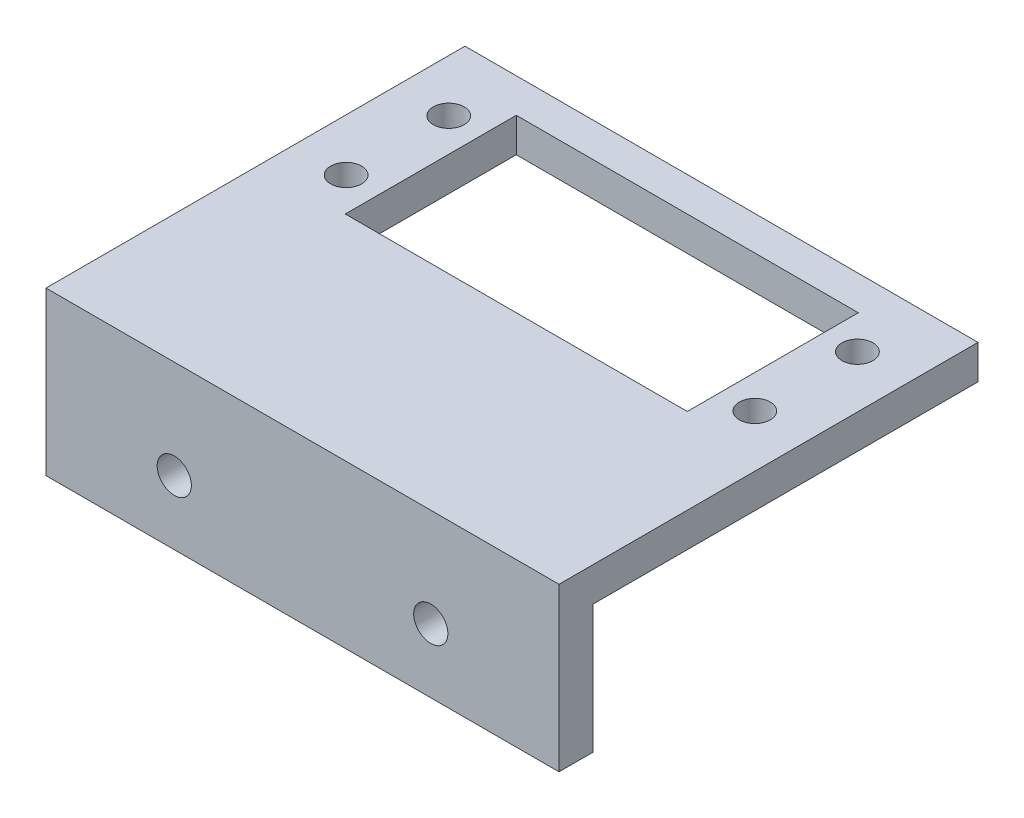
ISO-10303-21;
HEADER;
FILE_DESCRIPTION(('STEP AP214'),'2;1');
FILE_NAME('part.step','',(''),(''),'','','');
FILE_SCHEMA(('AUTOMOTIVE_DESIGN { 1 0 10303 214 1 1 1 1 }'));
ENDSEC;
DATA;
#1=APPLICATION_CONTEXT('core data for automotive mechanical design processes');
#2=APPLICATION_PROTOCOL_DEFINITION('international standard','automotive_design',2000,#1);
#3=PRODUCT_CONTEXT('',#1,'mechanical');
#4=PRODUCT('Part','Part','',(#3));
#5=PRODUCT_RELATED_PRODUCT_CATEGORY('part','',(#4));
#6=PRODUCT_DEFINITION_FORMATION('','',#4);
#7=PRODUCT_DEFINITION_CONTEXT('part definition',#1,'design');
#8=PRODUCT_DEFINITION('design','',#6,#7);
#9=PRODUCT_DEFINITION_SHAPE('','',#8);
#10=(LENGTH_UNIT() NAMED_UNIT(*) SI_UNIT(.MILLI.,.METRE.));
#11=(NAMED_UNIT(*) PLANE_ANGLE_UNIT() SI_UNIT($,.RADIAN.));
#12=(NAMED_UNIT(*) SI_UNIT($,.STERADIAN.) SOLID_ANGLE_UNIT());
#13=UNCERTAINTY_MEASURE_WITH_UNIT(LENGTH_MEASURE(1.E-05),#10,'distance_accuracy_value','');
#14=(GEOMETRIC_REPRESENTATION_CONTEXT(3) GLOBAL_UNCERTAINTY_ASSIGNED_CONTEXT((#13)) GLOBAL_UNIT_ASSIGNED_CONTEXT((#10,
#11,#12)) REPRESENTATION_CONTEXT('',''));
#15=CARTESIAN_POINT('',(0.,0.,0.));
#16=DIRECTION('',(0.,0.,1.));
#17=DIRECTION('',(1.,0.,0.));
#18=AXIS2_PLACEMENT_3D('',#15,#16,#17);
#19=CARTESIAN_POINT('',(30.,-25.,4.));
#20=DIRECTION('',(-1.,0.,0.));
#21=DIRECTION('',(0.,0.,1.));
#22=AXIS2_PLACEMENT_3D('',#19,#20,#21);
#23=PLANE('',#22);
#24=DIRECTION('',(0.,1.,0.));
#25=VECTOR('',#24,1.);
#26=CARTESIAN_POINT('',(30.,-25.,4.));
#27=LINE('',#26,#25);
#28=CARTESIAN_POINT('',(30.,6.,4.));
#29=VERTEX_POINT('',#28);
#30=CARTESIAN_POINT('',(30.,25.,4.));
#31=VERTEX_POINT('',#30);
#32=EDGE_CURVE('E137',#29,#31,#27,.T.);
#33=ORIENTED_EDGE('',*,*,#32,.F.);
#34=DIRECTION('',(0.,0.,-1.));
#35=VECTOR('',#34,1.);
#36=CARTESIAN_POINT('',(30.,6.,10.));
#37=LINE('',#36,#35);
#38=CARTESIAN_POINT('',(30.,6.,0.));
#39=VERTEX_POINT('',#38);
#40=EDGE_CURVE('E123',#29,#39,#37,.T.);
#41=ORIENTED_EDGE('',*,*,#40,.T.);
#42=DIRECTION('',(0.,1.,0.));
#43=VECTOR('',#42,1.);
#44=CARTESIAN_POINT('',(30.,-25.,0.));
#45=LINE('',#44,#43);
#46=CARTESIAN_POINT('',(30.,21.,0.));
#47=VERTEX_POINT('',#46);
#48=EDGE_CURVE('E134',#39,#47,#45,.T.);
#49=ORIENTED_EDGE('',*,*,#48,.T.);
#50=DIRECTION('',(0.,0.,1.));
#51=VECTOR('',#50,1.);
#52=CARTESIAN_POINT('',(30.,21.,-45.));
#53=LINE('',#52,#51);
#54=CARTESIAN_POINT('',(30.,21.,-45.));
#55=VERTEX_POINT('',#54);
#56=EDGE_CURVE('E147',#55,#47,#53,.T.);
#57=ORIENTED_EDGE('',*,*,#56,.F.);
#58=DIRECTION('',(0.,-1.,0.));
#59=VECTOR('',#58,1.);
#60=CARTESIAN_POINT('',(30.,25.,-45.));
#61=LINE('',#60,#59);
#62=CARTESIAN_POINT('',(30.,25.,-45.));
#63=VERTEX_POINT('',#62);
#64=EDGE_CURVE('E253',#63,#55,#61,.T.);
#65=ORIENTED_EDGE('',*,*,#64,.F.);
#66=DIRECTION('',(0.,0.,-1.));
#67=VECTOR('',#66,1.);
#68=CARTESIAN_POINT('',(30.,25.,4.));
#69=LINE('',#68,#67);
#70=EDGE_CURVE('E161',#31,#63,#69,.T.);
#71=ORIENTED_EDGE('',*,*,#70,.F.);
#72=EDGE_LOOP('',(#33,#41,#49,#57,#65,#71));
#73=FACE_BOUND('',#72,.T.);
#74=ADVANCED_FACE('F43',(#73),#23,.F.);
#75=CARTESIAN_POINT('',(-30.,25.,4.));
#76=DIRECTION('',(0.,-1.,0.));
#77=DIRECTION('',(0.,0.,-1.));
#78=AXIS2_PLACEMENT_3D('',#75,#76,#77);
#79=PLANE('',#78);
#80=CARTESIAN_POINT('',(-23.9,25.,-37.));
#81=DIRECTION('',(0.,1.,0.));
#82=DIRECTION('',(0.,0.,1.));
#83=AXIS2_PLACEMENT_3D('',#80,#81,#82);
#84=CIRCLE('',#83,1.81);
#85=CARTESIAN_POINT('',(-23.9,25.,-35.19));
#86=VERTEX_POINT('',#85);
#87=EDGE_CURVE('E187',#86,#86,#84,.T.);
#88=ORIENTED_EDGE('',*,*,#87,.F.);
#89=EDGE_LOOP('',(#88));
#90=FACE_BOUND('',#89,.T.);
#91=CARTESIAN_POINT('',(-23.9,25.,-25.));
#92=DIRECTION('',(0.,1.,0.));
#93=DIRECTION('',(0.,0.,1.));
#94=AXIS2_PLACEMENT_3D('',#91,#92,#93);
#95=CIRCLE('',#94,1.81);
#96=CARTESIAN_POINT('',(-23.9,25.,-23.19));
#97=VERTEX_POINT('',#96);
#98=EDGE_CURVE('E195',#97,#97,#95,.T.);
#99=ORIENTED_EDGE('',*,*,#98,.F.);
#100=EDGE_LOOP('',(#99));
#101=FACE_BOUND('',#100,.T.);
#102=CARTESIAN_POINT('',(23.9,25.,-25.));
#103=DIRECTION('',(0.,1.,0.));
#104=DIRECTION('',(0.,0.,1.));
#105=AXIS2_PLACEMENT_3D('',#102,#103,#104);
#106=CIRCLE('',#105,1.81);
#107=CARTESIAN_POINT('',(23.9,25.,-23.19));
#108=VERTEX_POINT('',#107);
#109=EDGE_CURVE('E180',#108,#108,#106,.T.);
#110=ORIENTED_EDGE('',*,*,#109,.F.);
#111=EDGE_LOOP('',(#110));
#112=FACE_BOUND('',#111,.T.);
#113=CARTESIAN_POINT('',(23.9,25.,-37.));
#114=DIRECTION('',(0.,1.,0.));
#115=DIRECTION('',(0.,0.,1.));
#116=AXIS2_PLACEMENT_3D('',#113,#114,#115);
#117=CIRCLE('',#116,1.81);
#118=CARTESIAN_POINT('',(23.9,25.,-35.19));
#119=VERTEX_POINT('',#118);
#120=EDGE_CURVE('E193',#119,#119,#117,.T.);
#121=ORIENTED_EDGE('',*,*,#120,.F.);
#122=EDGE_LOOP('',(#121));
#123=FACE_BOUND('',#122,.T.);
#124=DIRECTION('',(-1.,0.,0.));
#125=VECTOR('',#124,1.);
#126=CARTESIAN_POINT('',(-20.,25.,-41.));
#127=LINE('',#126,#125);
#128=CARTESIAN_POINT('',(20.,25.,-41.));
#129=VERTEX_POINT('',#128);
#130=CARTESIAN_POINT('',(-20.,25.,-41.));
#131=VERTEX_POINT('',#130);
#132=EDGE_CURVE('E229',#129,#131,#127,.T.);
#133=ORIENTED_EDGE('',*,*,#132,.F.);
#134=DIRECTION('',(0.,0.,-1.));
#135=VECTOR('',#134,1.);
#136=CARTESIAN_POINT('',(20.,25.,-21.));
#137=LINE('',#136,#135);
#138=CARTESIAN_POINT('',(20.,25.,-21.));
#139=VERTEX_POINT('',#138);
#140=EDGE_CURVE('E68',#139,#129,#137,.T.);
#141=ORIENTED_EDGE('',*,*,#140,.F.);
#142=DIRECTION('',(1.,0.,0.));
#143=VECTOR('',#142,1.);
#144=CARTESIAN_POINT('',(-20.,25.,-21.));
#145=LINE('',#144,#143);
#146=CARTESIAN_POINT('',(-20.,25.,-21.));
#147=VERTEX_POINT('',#146);
#148=EDGE_CURVE('E237',#147,#139,#145,.T.);
#149=ORIENTED_EDGE('',*,*,#148,.F.);
#150=DIRECTION('',(0.,0.,1.));
#151=VECTOR('',#150,1.);
#152=CARTESIAN_POINT('',(-20.,25.,-21.));
#153=LINE('',#152,#151);
#154=EDGE_CURVE('E233',#131,#147,#153,.T.);
#155=ORIENTED_EDGE('',*,*,#154,.F.);
#156=EDGE_LOOP('',(#133,#141,#149,#155));
#157=FACE_BOUND('',#156,.T.);
#158=ORIENTED_EDGE('',*,*,#70,.T.);
#159=DIRECTION('',(1.,0.,0.));
#160=VECTOR('',#159,1.);
#161=CARTESIAN_POINT('',(30.,25.,-45.));
#162=LINE('',#161,#160);
#163=CARTESIAN_POINT('',(-30.,25.,-45.));
#164=VERTEX_POINT('',#163);
#165=EDGE_CURVE('E264',#164,#63,#162,.T.);
#166=ORIENTED_EDGE('',*,*,#165,.F.);
#167=DIRECTION('',(0.,0.,-1.));
#168=VECTOR('',#167,1.);
#169=CARTESIAN_POINT('',(-30.,25.,4.));
#170=LINE('',#169,#168);
#171=CARTESIAN_POINT('',(-30.,25.,4.));
#172=VERTEX_POINT('',#171);
#173=EDGE_CURVE('E158',#172,#164,#170,.T.);
#174=ORIENTED_EDGE('',*,*,#173,.F.);
#175=DIRECTION('',(-1.,0.,0.));
#176=VECTOR('',#175,1.);
#177=CARTESIAN_POINT('',(-30.,25.,4.));
#178=LINE('',#177,#176);
#179=EDGE_CURVE('E274',#31,#172,#178,.T.);
#180=ORIENTED_EDGE('',*,*,#179,.F.);
#181=EDGE_LOOP('',(#158,#166,#174,#180));
#182=FACE_BOUND('',#181,.T.);
#183=ADVANCED_FACE('F294',(#90,#101,#112,#123,#157,#182),#79,.F.);
#184=CARTESIAN_POINT('',(-30.,-25.,4.));
#185=DIRECTION('',(1.,0.,0.));
#186=DIRECTION('',(0.,0.,-1.));
#187=AXIS2_PLACEMENT_3D('',#184,#185,#186);
#188=PLANE('',#187);
#189=DIRECTION('',(0.,-1.,0.));
#190=VECTOR('',#189,1.);
#191=CARTESIAN_POINT('',(-30.,-25.,0.));
#192=LINE('',#191,#190);
#193=CARTESIAN_POINT('',(-30.,21.,0.));
#194=VERTEX_POINT('',#193);
#195=CARTESIAN_POINT('',(-30.,6.,0.));
#196=VERTEX_POINT('',#195);
#197=EDGE_CURVE('E146',#194,#196,#192,.T.);
#198=ORIENTED_EDGE('',*,*,#197,.T.);
#199=DIRECTION('',(0.,0.,-1.));
#200=VECTOR('',#199,1.);
#201=CARTESIAN_POINT('',(-30.,6.00000000000001,10.));
#202=LINE('',#201,#200);
#203=CARTESIAN_POINT('',(-30.,6.00000000000001,4.));
#204=VERTEX_POINT('',#203);
#205=EDGE_CURVE('E60',#204,#196,#202,.T.);
#206=ORIENTED_EDGE('',*,*,#205,.F.);
#207=DIRECTION('',(0.,-1.,0.));
#208=VECTOR('',#207,1.);
#209=CARTESIAN_POINT('',(-30.,-25.,4.));
#210=LINE('',#209,#208);
#211=EDGE_CURVE('E155',#172,#204,#210,.T.);
#212=ORIENTED_EDGE('',*,*,#211,.F.);
#213=ORIENTED_EDGE('',*,*,#173,.T.);
#214=DIRECTION('',(0.,1.,0.));
#215=VECTOR('',#214,1.);
#216=CARTESIAN_POINT('',(-30.,25.,-45.));
#217=LINE('',#216,#215);
#218=CARTESIAN_POINT('',(-30.,21.,-45.));
#219=VERTEX_POINT('',#218);
#220=EDGE_CURVE('E260',#219,#164,#217,.T.);
#221=ORIENTED_EDGE('',*,*,#220,.F.);
#222=DIRECTION('',(0.,0.,1.));
#223=VECTOR('',#222,1.);
#224=CARTESIAN_POINT('',(-30.,21.,-45.));
#225=LINE('',#224,#223);
#226=EDGE_CURVE('E152',#219,#194,#225,.T.);
#227=ORIENTED_EDGE('',*,*,#226,.T.);
#228=EDGE_LOOP('',(#198,#206,#212,#213,#221,#227));
#229=FACE_BOUND('',#228,.T.);
#230=ADVANCED_FACE('F284',(#229),#188,.F.);
#231=CARTESIAN_POINT('',(0.,0.,4.));
#232=DIRECTION('',(0.,0.,-1.));
#233=DIRECTION('',(-1.,0.,0.));
#234=AXIS2_PLACEMENT_3D('',#231,#232,#233);
#235=PLANE('',#234);
#236=CARTESIAN_POINT('',(15.,13.5,4.));
#237=DIRECTION('',(0.,0.,-1.));
#238=DIRECTION('',(-1.,0.,0.));
#239=AXIS2_PLACEMENT_3D('',#236,#237,#238);
#240=CIRCLE('',#239,2.);
#241=CARTESIAN_POINT('',(13.,13.5,4.));
#242=VERTEX_POINT('',#241);
#243=EDGE_CURVE('E129',#242,#242,#240,.T.);
#244=ORIENTED_EDGE('',*,*,#243,.T.);
#245=EDGE_LOOP('',(#244));
#246=FACE_BOUND('',#245,.T.);
#247=CARTESIAN_POINT('',(-15.,13.5,4.));
#248=DIRECTION('',(0.,0.,-1.));
#249=DIRECTION('',(-1.,0.,0.));
#250=AXIS2_PLACEMENT_3D('',#247,#248,#249);
#251=CIRCLE('',#250,2.);
#252=CARTESIAN_POINT('',(-17.,13.5,4.));
#253=VERTEX_POINT('',#252);
#254=EDGE_CURVE('E183',#253,#253,#251,.T.);
#255=ORIENTED_EDGE('',*,*,#254,.T.);
#256=EDGE_LOOP('',(#255));
#257=FACE_BOUND('',#256,.T.);
#258=ORIENTED_EDGE('',*,*,#211,.T.);
#259=DIRECTION('',(1.,0.,0.));
#260=VECTOR('',#259,1.);
#261=CARTESIAN_POINT('',(0.,6.,4.));
#262=LINE('',#261,#260);
#263=EDGE_CURVE('E139',#204,#29,#262,.T.);
#264=ORIENTED_EDGE('',*,*,#263,.T.);
#265=ORIENTED_EDGE('',*,*,#32,.T.);
#266=ORIENTED_EDGE('',*,*,#179,.T.);
#267=EDGE_LOOP('',(#258,#264,#265,#266));
#268=FACE_BOUND('',#267,.T.);
#269=ADVANCED_FACE('F282',(#246,#257,#268),#235,.F.);
#270=CARTESIAN_POINT('',(0.,0.,0.));
#271=DIRECTION('',(0.,0.,-1.));
#272=DIRECTION('',(-1.,0.,0.));
#273=AXIS2_PLACEMENT_3D('',#270,#271,#272);
#274=PLANE('',#273);
#275=CARTESIAN_POINT('',(15.,13.5,0.));
#276=DIRECTION('',(0.,0.,-1.));
#277=DIRECTION('',(-1.,0.,0.));
#278=AXIS2_PLACEMENT_3D('',#275,#276,#277);
#279=CIRCLE('',#278,2.);
#280=CARTESIAN_POINT('',(13.,13.5,0.));
#281=VERTEX_POINT('',#280);
#282=EDGE_CURVE('E212',#281,#281,#279,.T.);
#283=ORIENTED_EDGE('',*,*,#282,.F.);
#284=EDGE_LOOP('',(#283));
#285=FACE_BOUND('',#284,.T.);
#286=CARTESIAN_POINT('',(-15.,13.5,0.));
#287=DIRECTION('',(0.,0.,-1.));
#288=DIRECTION('',(-1.,0.,0.));
#289=AXIS2_PLACEMENT_3D('',#286,#287,#288);
#290=CIRCLE('',#289,2.);
#291=CARTESIAN_POINT('',(-17.,13.5,0.));
#292=VERTEX_POINT('',#291);
#293=EDGE_CURVE('E216',#292,#292,#290,.T.);
#294=ORIENTED_EDGE('',*,*,#293,.F.);
#295=EDGE_LOOP('',(#294));
#296=FACE_BOUND('',#295,.T.);
#297=DIRECTION('',(1.,0.,0.));
#298=VECTOR('',#297,1.);
#299=CARTESIAN_POINT('',(0.,6.,0.));
#300=LINE('',#299,#298);
#301=EDGE_CURVE('E120',#196,#39,#300,.T.);
#302=ORIENTED_EDGE('',*,*,#301,.F.);
#303=ORIENTED_EDGE('',*,*,#197,.F.);
#304=DIRECTION('',(-1.,0.,0.));
#305=VECTOR('',#304,1.);
#306=CARTESIAN_POINT('',(30.,21.,0.));
#307=LINE('',#306,#305);
#308=EDGE_CURVE('E143',#47,#194,#307,.T.);
#309=ORIENTED_EDGE('',*,*,#308,.F.);
#310=ORIENTED_EDGE('',*,*,#48,.F.);
#311=EDGE_LOOP('',(#302,#303,#309,#310));
#312=FACE_BOUND('',#311,.T.);
#313=ADVANCED_FACE('F141',(#285,#296,#312),#274,.T.);
#314=CARTESIAN_POINT('',(30.,21.,-45.));
#315=DIRECTION('',(0.,1.,0.));
#316=DIRECTION('',(0.,0.,1.));
#317=AXIS2_PLACEMENT_3D('',#314,#315,#316);
#318=PLANE('',#317);
#319=CARTESIAN_POINT('',(-23.9,21.,-37.));
#320=DIRECTION('',(0.,1.,0.));
#321=DIRECTION('',(0.,0.,1.));
#322=AXIS2_PLACEMENT_3D('',#319,#320,#321);
#323=CIRCLE('',#322,1.81);
#324=CARTESIAN_POINT('',(-23.9,21.,-35.19));
#325=VERTEX_POINT('',#324);
#326=EDGE_CURVE('E46',#325,#325,#323,.T.);
#327=ORIENTED_EDGE('',*,*,#326,.T.);
#328=EDGE_LOOP('',(#327));
#329=FACE_BOUND('',#328,.T.);
#330=CARTESIAN_POINT('',(-23.9,21.,-25.));
#331=DIRECTION('',(0.,1.,0.));
#332=DIRECTION('',(0.,0.,1.));
#333=AXIS2_PLACEMENT_3D('',#330,#331,#332);
#334=CIRCLE('',#333,1.81);
#335=CARTESIAN_POINT('',(-23.9,21.,-23.19));
#336=VERTEX_POINT('',#335);
#337=EDGE_CURVE('E184',#336,#336,#334,.T.);
#338=ORIENTED_EDGE('',*,*,#337,.T.);
#339=EDGE_LOOP('',(#338));
#340=FACE_BOUND('',#339,.T.);
#341=CARTESIAN_POINT('',(23.9,21.,-25.));
#342=DIRECTION('',(0.,1.,0.));
#343=DIRECTION('',(0.,0.,1.));
#344=AXIS2_PLACEMENT_3D('',#341,#342,#343);
#345=CIRCLE('',#344,1.81);
#346=CARTESIAN_POINT('',(23.9,21.,-23.19));
#347=VERTEX_POINT('',#346);
#348=EDGE_CURVE('E179',#347,#347,#345,.T.);
#349=ORIENTED_EDGE('',*,*,#348,.T.);
#350=EDGE_LOOP('',(#349));
#351=FACE_BOUND('',#350,.T.);
#352=CARTESIAN_POINT('',(23.9,21.,-37.));
#353=DIRECTION('',(0.,1.,0.));
#354=DIRECTION('',(0.,0.,1.));
#355=AXIS2_PLACEMENT_3D('',#352,#353,#354);
#356=CIRCLE('',#355,1.81);
#357=CARTESIAN_POINT('',(23.9,21.,-35.19));
#358=VERTEX_POINT('',#357);
#359=EDGE_CURVE('E175',#358,#358,#356,.T.);
#360=ORIENTED_EDGE('',*,*,#359,.T.);
#361=EDGE_LOOP('',(#360));
#362=FACE_BOUND('',#361,.T.);
#363=DIRECTION('',(1.,0.,0.));
#364=VECTOR('',#363,1.);
#365=CARTESIAN_POINT('',(30.,21.,-21.));
#366=LINE('',#365,#364);
#367=CARTESIAN_POINT('',(-20.,21.,-21.));
#368=VERTEX_POINT('',#367);
#369=CARTESIAN_POINT('',(20.,21.,-21.));
#370=VERTEX_POINT('',#369);
#371=EDGE_CURVE('E52',#368,#370,#366,.T.);
#372=ORIENTED_EDGE('',*,*,#371,.T.);
#373=DIRECTION('',(0.,0.,-1.));
#374=VECTOR('',#373,1.);
#375=CARTESIAN_POINT('',(20.,21.,-45.));
#376=LINE('',#375,#374);
#377=CARTESIAN_POINT('',(20.,21.,-41.));
#378=VERTEX_POINT('',#377);
#379=EDGE_CURVE('E11',#370,#378,#376,.T.);
#380=ORIENTED_EDGE('',*,*,#379,.T.);
#381=DIRECTION('',(-1.,0.,0.));
#382=VECTOR('',#381,1.);
#383=CARTESIAN_POINT('',(30.,21.,-41.));
#384=LINE('',#383,#382);
#385=CARTESIAN_POINT('',(-20.,21.,-41.));
#386=VERTEX_POINT('',#385);
#387=EDGE_CURVE('E164',#378,#386,#384,.T.);
#388=ORIENTED_EDGE('',*,*,#387,.T.);
#389=DIRECTION('',(0.,0.,1.));
#390=VECTOR('',#389,1.);
#391=CARTESIAN_POINT('',(-20.,21.,-45.));
#392=LINE('',#391,#390);
#393=EDGE_CURVE('E168',#386,#368,#392,.T.);
#394=ORIENTED_EDGE('',*,*,#393,.T.);
#395=EDGE_LOOP('',(#372,#380,#388,#394));
#396=FACE_BOUND('',#395,.T.);
#397=ORIENTED_EDGE('',*,*,#308,.T.);
#398=ORIENTED_EDGE('',*,*,#226,.F.);
#399=DIRECTION('',(-1.,0.,0.));
#400=VECTOR('',#399,1.);
#401=CARTESIAN_POINT('',(30.,21.,-45.));
#402=LINE('',#401,#400);
#403=EDGE_CURVE('E257',#55,#219,#402,.T.);
#404=ORIENTED_EDGE('',*,*,#403,.F.);
#405=ORIENTED_EDGE('',*,*,#56,.T.);
#406=EDGE_LOOP('',(#397,#398,#404,#405));
#407=FACE_BOUND('',#406,.T.);
#408=ADVANCED_FACE('F288',(#329,#340,#351,#362,#396,#407),#318,.F.);
#409=CARTESIAN_POINT('',(0.,0.,-45.));
#410=DIRECTION('',(0.,0.,-1.));
#411=DIRECTION('',(-1.,0.,0.));
#412=AXIS2_PLACEMENT_3D('',#409,#410,#411);
#413=PLANE('',#412);
#414=ORIENTED_EDGE('',*,*,#64,.T.);
#415=ORIENTED_EDGE('',*,*,#403,.T.);
#416=ORIENTED_EDGE('',*,*,#220,.T.);
#417=ORIENTED_EDGE('',*,*,#165,.T.);
#418=EDGE_LOOP('',(#414,#415,#416,#417));
#419=FACE_BOUND('',#418,.T.);
#420=ADVANCED_FACE('F291',(#419),#413,.T.);
#421=CARTESIAN_POINT('',(20.,-35.,-21.));
#422=DIRECTION('',(1.,0.,0.));
#423=DIRECTION('',(0.,0.,-1.));
#424=AXIS2_PLACEMENT_3D('',#421,#422,#423);
#425=PLANE('',#424);
#426=DIRECTION('',(0.,1.,0.));
#427=VECTOR('',#426,1.);
#428=CARTESIAN_POINT('',(20.,-35.,-21.));
#429=LINE('',#428,#427);
#430=EDGE_CURVE('E242',#370,#139,#429,.T.);
#431=ORIENTED_EDGE('',*,*,#430,.T.);
#432=ORIENTED_EDGE('',*,*,#140,.T.);
#433=DIRECTION('',(0.,1.,0.));
#434=VECTOR('',#433,1.);
#435=CARTESIAN_POINT('',(20.,-35.,-41.));
#436=LINE('',#435,#434);
#437=EDGE_CURVE('E241',#378,#129,#436,.T.);
#438=ORIENTED_EDGE('',*,*,#437,.F.);
#439=ORIENTED_EDGE('',*,*,#379,.F.);
#440=EDGE_LOOP('',(#431,#432,#438,#439));
#441=FACE_BOUND('',#440,.T.);
#442=ADVANCED_FACE('F315',(#441),#425,.F.);
#443=CARTESIAN_POINT('',(-20.,-35.,-21.));
#444=DIRECTION('',(0.,0.,1.));
#445=DIRECTION('',(1.,0.,0.));
#446=AXIS2_PLACEMENT_3D('',#443,#444,#445);
#447=PLANE('',#446);
#448=DIRECTION('',(0.,1.,0.));
#449=VECTOR('',#448,1.);
#450=CARTESIAN_POINT('',(-20.,-35.,-21.));
#451=LINE('',#450,#449);
#452=EDGE_CURVE('E245',#368,#147,#451,.T.);
#453=ORIENTED_EDGE('',*,*,#452,.T.);
#454=ORIENTED_EDGE('',*,*,#148,.T.);
#455=ORIENTED_EDGE('',*,*,#430,.F.);
#456=ORIENTED_EDGE('',*,*,#371,.F.);
#457=EDGE_LOOP('',(#453,#454,#455,#456));
#458=FACE_BOUND('',#457,.T.);
#459=ADVANCED_FACE('F318',(#458),#447,.F.);
#460=CARTESIAN_POINT('',(-20.,-35.,-21.));
#461=DIRECTION('',(-1.,0.,0.));
#462=DIRECTION('',(0.,0.,1.));
#463=AXIS2_PLACEMENT_3D('',#460,#461,#462);
#464=PLANE('',#463);
#465=DIRECTION('',(0.,1.,0.));
#466=VECTOR('',#465,1.);
#467=CARTESIAN_POINT('',(-20.,-35.,-41.));
#468=LINE('',#467,#466);
#469=EDGE_CURVE('E248',#386,#131,#468,.T.);
#470=ORIENTED_EDGE('',*,*,#469,.T.);
#471=ORIENTED_EDGE('',*,*,#154,.T.);
#472=ORIENTED_EDGE('',*,*,#452,.F.);
#473=ORIENTED_EDGE('',*,*,#393,.F.);
#474=EDGE_LOOP('',(#470,#471,#472,#473));
#475=FACE_BOUND('',#474,.T.);
#476=ADVANCED_FACE('F322',(#475),#464,.F.);
#477=CARTESIAN_POINT('',(-20.,-35.,-41.));
#478=DIRECTION('',(0.,0.,-1.));
#479=DIRECTION('',(-1.,0.,0.));
#480=AXIS2_PLACEMENT_3D('',#477,#478,#479);
#481=PLANE('',#480);
#482=ORIENTED_EDGE('',*,*,#437,.T.);
#483=ORIENTED_EDGE('',*,*,#132,.T.);
#484=ORIENTED_EDGE('',*,*,#469,.F.);
#485=ORIENTED_EDGE('',*,*,#387,.F.);
#486=EDGE_LOOP('',(#482,#483,#484,#485));
#487=FACE_BOUND('',#486,.T.);
#488=ADVANCED_FACE('F319',(#487),#481,.F.);
#489=CARTESIAN_POINT('',(0.,6.,10.));
#490=DIRECTION('',(0.,1.,0.));
#491=DIRECTION('',(-1.,0.,0.));
#492=AXIS2_PLACEMENT_3D('',#489,#490,#491);
#493=PLANE('',#492);
#494=ORIENTED_EDGE('',*,*,#205,.T.);
#495=ORIENTED_EDGE('',*,*,#301,.T.);
#496=ORIENTED_EDGE('',*,*,#40,.F.);
#497=ORIENTED_EDGE('',*,*,#263,.F.);
#498=EDGE_LOOP('',(#494,#495,#496,#497));
#499=FACE_BOUND('',#498,.T.);
#500=ADVANCED_FACE('F122',(#499),#493,.F.);
#501=CARTESIAN_POINT('',(-15.,13.5,4.));
#502=DIRECTION('',(0.,0.,-1.));
#503=DIRECTION('',(-1.,0.,0.));
#504=AXIS2_PLACEMENT_3D('',#501,#502,#503);
#505=CYLINDRICAL_SURFACE('',#504,2.);
#506=ORIENTED_EDGE('',*,*,#254,.F.);
#507=EDGE_LOOP('',(#506));
#508=FACE_BOUND('',#507,.T.);
#509=ORIENTED_EDGE('',*,*,#293,.T.);
#510=EDGE_LOOP('',(#509));
#511=FACE_BOUND('',#510,.T.);
#512=ADVANCED_FACE('F332',(#508,#511),#505,.F.);
#513=CARTESIAN_POINT('',(15.,13.5,4.));
#514=DIRECTION('',(0.,0.,-1.));
#515=DIRECTION('',(-1.,0.,0.));
#516=AXIS2_PLACEMENT_3D('',#513,#514,#515);
#517=CYLINDRICAL_SURFACE('',#516,2.);
#518=ORIENTED_EDGE('',*,*,#243,.F.);
#519=EDGE_LOOP('',(#518));
#520=FACE_BOUND('',#519,.T.);
#521=ORIENTED_EDGE('',*,*,#282,.T.);
#522=EDGE_LOOP('',(#521));
#523=FACE_BOUND('',#522,.T.);
#524=ADVANCED_FACE('F335',(#520,#523),#517,.F.);
#525=CARTESIAN_POINT('',(23.9,15.,-37.));
#526=DIRECTION('',(0.,1.,0.));
#527=DIRECTION('',(0.,0.,1.));
#528=AXIS2_PLACEMENT_3D('',#525,#526,#527);
#529=CYLINDRICAL_SURFACE('',#528,1.81);
#530=ORIENTED_EDGE('',*,*,#120,.T.);
#531=EDGE_LOOP('',(#530));
#532=FACE_BOUND('',#531,.T.);
#533=ORIENTED_EDGE('',*,*,#359,.F.);
#534=EDGE_LOOP('',(#533));
#535=FACE_BOUND('',#534,.T.);
#536=ADVANCED_FACE('F339',(#532,#535),#529,.F.);
#537=CARTESIAN_POINT('',(23.9,15.,-25.));
#538=DIRECTION('',(0.,1.,0.));
#539=DIRECTION('',(0.,0.,1.));
#540=AXIS2_PLACEMENT_3D('',#537,#538,#539);
#541=CYLINDRICAL_SURFACE('',#540,1.81);
#542=ORIENTED_EDGE('',*,*,#109,.T.);
#543=EDGE_LOOP('',(#542));
#544=FACE_BOUND('',#543,.T.);
#545=ORIENTED_EDGE('',*,*,#348,.F.);
#546=EDGE_LOOP('',(#545));
#547=FACE_BOUND('',#546,.T.);
#548=ADVANCED_FACE('F343',(#544,#547),#541,.F.);
#549=CARTESIAN_POINT('',(-23.9,6.,-25.));
#550=DIRECTION('',(0.,1.,0.));
#551=DIRECTION('',(0.,0.,1.));
#552=AXIS2_PLACEMENT_3D('',#549,#550,#551);
#553=CYLINDRICAL_SURFACE('',#552,1.81);
#554=ORIENTED_EDGE('',*,*,#98,.T.);
#555=EDGE_LOOP('',(#554));
#556=FACE_BOUND('',#555,.T.);
#557=ORIENTED_EDGE('',*,*,#337,.F.);
#558=EDGE_LOOP('',(#557));
#559=FACE_BOUND('',#558,.T.);
#560=ADVANCED_FACE('F347',(#556,#559),#553,.F.);
#561=CARTESIAN_POINT('',(-23.9,6.,-37.));
#562=DIRECTION('',(0.,1.,0.));
#563=DIRECTION('',(0.,0.,1.));
#564=AXIS2_PLACEMENT_3D('',#561,#562,#563);
#565=CYLINDRICAL_SURFACE('',#564,1.81);
#566=ORIENTED_EDGE('',*,*,#87,.T.);
#567=EDGE_LOOP('',(#566));
#568=FACE_BOUND('',#567,.T.);
#569=ORIENTED_EDGE('',*,*,#326,.F.);
#570=EDGE_LOOP('',(#569));
#571=FACE_BOUND('',#570,.T.);
#572=ADVANCED_FACE('F351',(#568,#571),#565,.F.);
#573=CLOSED_SHELL('',(#74,#183,#230,#269,#313,#408,#420,#442,#459,#476,#488,#500,#512,#524,#536,
#548,#560,#572));
#574=MANIFOLD_SOLID_BREP('B2',#573);
#575=ADVANCED_BREP_SHAPE_REPRESENTATION('',(#18,#574),#14);
#576=SHAPE_DEFINITION_REPRESENTATION(#9,#575);
ENDSEC;
END-ISO-10303-21;
